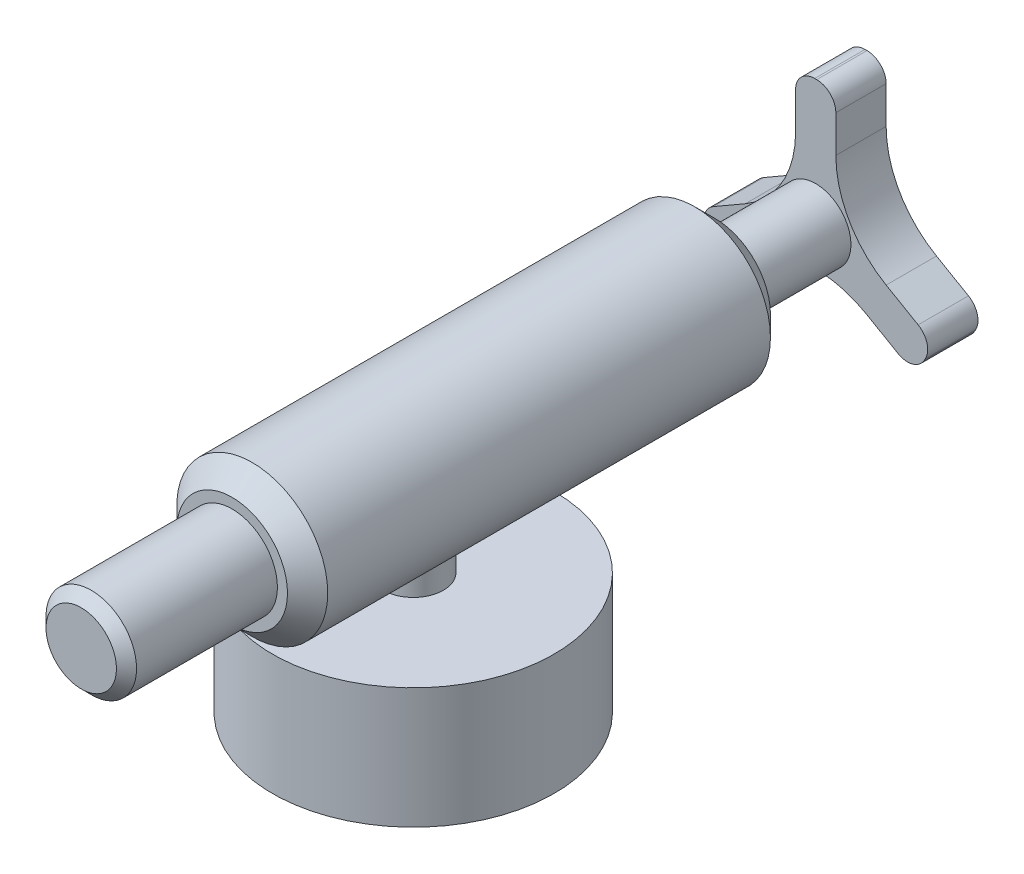
ISO-10303-21;
HEADER;
FILE_DESCRIPTION(('STEP AP214'),'2;1');
FILE_NAME('part.step','',(''),(''),'','','');
FILE_SCHEMA(('AUTOMOTIVE_DESIGN { 1 0 10303 214 1 1 1 1 }'));
ENDSEC;
DATA;
#1=APPLICATION_CONTEXT('core data for automotive mechanical design processes');
#2=APPLICATION_PROTOCOL_DEFINITION('international standard','automotive_design',2000,#1);
#3=PRODUCT_CONTEXT('',#1,'mechanical');
#4=PRODUCT('Part','Part','',(#3));
#5=PRODUCT_RELATED_PRODUCT_CATEGORY('part','',(#4));
#6=PRODUCT_DEFINITION_FORMATION('','',#4);
#7=PRODUCT_DEFINITION_CONTEXT('part definition',#1,'design');
#8=PRODUCT_DEFINITION('design','',#6,#7);
#9=PRODUCT_DEFINITION_SHAPE('','',#8);
#10=(LENGTH_UNIT() NAMED_UNIT(*) SI_UNIT(.MILLI.,.METRE.));
#11=(NAMED_UNIT(*) PLANE_ANGLE_UNIT() SI_UNIT($,.RADIAN.));
#12=(NAMED_UNIT(*) SI_UNIT($,.STERADIAN.) SOLID_ANGLE_UNIT());
#13=UNCERTAINTY_MEASURE_WITH_UNIT(LENGTH_MEASURE(1.E-05),#10,'distance_accuracy_value','');
#14=(GEOMETRIC_REPRESENTATION_CONTEXT(3) GLOBAL_UNCERTAINTY_ASSIGNED_CONTEXT((#13)) GLOBAL_UNIT_ASSIGNED_CONTEXT((#10,
#11,#12)) REPRESENTATION_CONTEXT('',''));
#15=CARTESIAN_POINT('',(0.,0.,0.));
#16=DIRECTION('',(0.,0.,1.));
#17=DIRECTION('',(1.,0.,0.));
#18=AXIS2_PLACEMENT_3D('',#15,#16,#17);
#19=CARTESIAN_POINT('',(0.,0.,0.));
#20=DIRECTION('',(0.,-1.,0.));
#21=DIRECTION('',(0.,0.,-1.));
#22=AXIS2_PLACEMENT_3D('',#19,#20,#21);
#23=CYLINDRICAL_SURFACE('',#22,3.);
#24=CARTESIAN_POINT('',(0.,12.,0.));
#25=DIRECTION('',(0.,-1.,0.));
#26=DIRECTION('',(0.,0.,-1.));
#27=AXIS2_PLACEMENT_3D('',#24,#25,#26);
#28=CIRCLE('',#27,3.);
#29=CARTESIAN_POINT('',(0.,12.,-3.));
#30=VERTEX_POINT('',#29);
#31=EDGE_CURVE('E276',#30,#30,#28,.T.);
#32=ORIENTED_EDGE('',*,*,#31,.F.);
#33=EDGE_LOOP('',(#32));
#34=FACE_BOUND('',#33,.T.);
#35=CARTESIAN_POINT('',(0.,14.5,-3.));
#36=CARTESIAN_POINT('',(-0.0806632009395358,14.5000011102953,-2.9999983890229));
#37=CARTESIAN_POINT('',(-0.161354413498373,14.5013063104993,-2.99674011548));
#38=CARTESIAN_POINT('',(-0.322146094522253,14.5064881382347,-2.9837470954671));
#39=CARTESIAN_POINT('',(-0.402246157981983,14.5103663882538,-2.97400826254011));
#40=CARTESIAN_POINT('',(-0.641096781067452,14.5257536519124,-2.9351288598822));
#41=CARTESIAN_POINT('',(-0.798158082521719,14.5410147773376,-2.89632569245522));
#42=CARTESIAN_POINT('',(-1.10247033899881,14.5798854087302,-2.79468577218911));
#43=CARTESIAN_POINT('',(-1.24975157753076,14.6034675647033,-2.73192770096983));
#44=CARTESIAN_POINT('',(-1.53159737405797,14.6566512277593,-2.58447126970495));
#45=CARTESIAN_POINT('',(-1.66616632427491,14.6862506445953,-2.49978052573424));
#46=CARTESIAN_POINT('',(-1.92525452632722,14.7500365964064,-2.30664674369764));
#47=CARTESIAN_POINT('',(-2.04909421803168,14.7843655162606,-2.19734001336868));
#48=CARTESIAN_POINT('',(-2.27726169757605,14.8530913762232,-1.95989999705686));
#49=CARTESIAN_POINT('',(-2.38157993941976,14.8874883413408,-1.8317575548035));
#50=CARTESIAN_POINT('',(-2.5723120820679,14.9541581145327,-1.55335789398784));
#51=CARTESIAN_POINT('',(-2.65772253361338,14.9862682582561,-1.40237027079118));
#52=CARTESIAN_POINT('',(-2.80163201676496,15.0424952944666,-1.08669540254387));
#53=CARTESIAN_POINT('',(-2.86014383023324,15.066615981907,-0.922014708274903));
#54=CARTESIAN_POINT('',(-2.94584825055478,15.1026046345439,-0.591431499566553));
#55=CARTESIAN_POINT('',(-2.974340952837,15.1149786946074,-0.425923146617134));
#56=CARTESIAN_POINT('',(-3.00325943833354,15.1275399393214,-0.0920475025576346));
#57=CARTESIAN_POINT('',(-3.00369902341366,15.1277331168493,0.076318341908644));
#58=CARTESIAN_POINT('',(-2.97748405223855,15.1163424960873,0.398635007225334));
#59=CARTESIAN_POINT('',(-2.95271297167583,15.1055773755829,0.552773571723856));
#60=CARTESIAN_POINT('',(-2.87992032013237,15.074857187058,0.854489334113111));
#61=CARTESIAN_POINT('',(-2.83189469212407,15.0549005154937,1.00206538218922));
#62=CARTESIAN_POINT('',(-2.71304209891512,15.0076077233483,1.29002675426027));
#63=CARTESIAN_POINT('',(-2.64176979349676,14.9801293107012,1.43020385857296));
#64=CARTESIAN_POINT('',(-2.47875969107453,14.9209282542387,1.69712372455143));
#65=CARTESIAN_POINT('',(-2.38701420764467,14.8892040181714,1.82386141410673));
#66=CARTESIAN_POINT('',(-2.17732589918875,14.82209894884,2.07061459320028));
#67=CARTESIAN_POINT('',(-2.05790619445786,14.7866250253508,2.1893530941683));
#68=CARTESIAN_POINT('',(-1.80047164114338,14.7181026256327,2.40552671700379));
#69=CARTESIAN_POINT('',(-1.66245309800114,14.685054633322,2.50295759611564));
#70=CARTESIAN_POINT('',(-1.36811647890929,14.6242797810299,2.67542617112355));
#71=CARTESIAN_POINT('',(-1.21149073701985,14.5966709485683,2.74998342179553));
#72=CARTESIAN_POINT('',(-0.886535648224184,14.5507775750691,2.87125179161714));
#73=CARTESIAN_POINT('',(-0.718212295274479,14.5324882980644,2.91797705633613));
#74=CARTESIAN_POINT('',(-0.385343831411759,14.5081579073962,2.97967244312955));
#75=CARTESIAN_POINT('',(-0.221164940978293,14.5014558124973,2.99635868138034));
#76=CARTESIAN_POINT('',(0.107767964711718,14.4989728223406,3.00256965079292));
#77=CARTESIAN_POINT('',(0.272521819835824,14.5031890962656,2.99210142232125));
#78=CARTESIAN_POINT('',(0.590149108683041,14.5216364940437,2.94556237117203));
#79=CARTESIAN_POINT('',(0.743223737663438,14.5354091298172,2.91066302947361));
#80=CARTESIAN_POINT('',(1.04120314209095,14.5711083789175,2.81784643753521));
#81=CARTESIAN_POINT('',(1.18610686533643,14.593036039652,2.7599262304967));
#82=CARTESIAN_POINT('',(1.46861817872592,14.6437510784379,2.62082259048036));
#83=CARTESIAN_POINT('',(1.60586703413639,14.6727277603032,2.53898179193636));
#84=CARTESIAN_POINT('',(1.86516538686655,14.7343995288168,2.35508951414045));
#85=CARTESIAN_POINT('',(1.98720876112942,14.7670961033449,2.25302993561202));
#86=CARTESIAN_POINT('',(2.2210845645563,14.8353232354295,2.02369498057988));
#87=CARTESIAN_POINT('',(2.3317109007594,14.8708983786286,1.89519968775731));
#88=CARTESIAN_POINT('',(2.53012679607026,14.9388749062386,1.62083987546932));
#89=CARTESIAN_POINT('',(2.6179125918181,14.9712757670859,1.47497249942789));
#90=CARTESIAN_POINT('',(2.76871125308743,15.029285501401,1.16780745817163));
#91=CARTESIAN_POINT('',(2.83147589251401,15.0548255367903,1.00637400141696));
#92=CARTESIAN_POINT('',(2.92844432884615,15.0951448977689,0.673899522192013));
#93=CARTESIAN_POINT('',(2.96266920524751,15.1099321643282,0.502865690403395));
#94=CARTESIAN_POINT('',(2.9995734283829,15.1259236107162,0.16930814815297));
#95=CARTESIAN_POINT('',(3.00434563234764,15.1280286856534,0.00705774354923237));
#96=CARTESIAN_POINT('',(2.98770473002408,15.1207774587277,-0.315817289508828));
#97=CARTESIAN_POINT('',(2.96629494876877,15.1114226122398,-0.476442121794099));
#98=CARTESIAN_POINT('',(2.89960708102334,15.0831002665888,-0.784998274274976));
#99=CARTESIAN_POINT('',(2.85530635681061,15.0645275327494,-0.933180373161246));
#100=CARTESIAN_POINT('',(2.7450080562502,15.0201399713456,-1.22006798291911));
#101=CARTESIAN_POINT('',(2.67900448789151,14.9943231440242,-1.35877086385317));
#102=CARTESIAN_POINT('',(2.52280960319953,14.9365208959876,-1.63141427718623));
#103=CARTESIAN_POINT('',(2.43144976133989,14.9042669187468,-1.76462742397582));
#104=CARTESIAN_POINT('',(2.2288364197758,14.8380427809247,-2.01449055720097));
#105=CARTESIAN_POINT('',(2.11757692397659,14.8040721052933,-2.13113553231325));
#106=CARTESIAN_POINT('',(1.86976526416226,14.7355971048839,-2.35230196481483));
#107=CARTESIAN_POINT('',(1.73204093441049,14.7012009805601,-2.45554705905594));
#108=CARTESIAN_POINT('',(1.43982353523661,14.6379915482106,-2.63751446935514));
#109=CARTESIAN_POINT('',(1.28532271229705,14.6091808388515,-2.71622538095622));
#110=CARTESIAN_POINT('',(1.04589046292377,14.5728517211392,-2.81307350088879));
#111=CARTESIAN_POINT('',(0.965550642326296,14.561957476294,-2.84165597012401));
#112=CARTESIAN_POINT('',(0.802472015195127,14.5426037620575,-2.89193765829433));
#113=CARTESIAN_POINT('',(0.719734347003783,14.5341431575171,-2.91364008684478));
#114=CARTESIAN_POINT('',(0.552707555877389,14.5199245649965,-2.94988203096378));
#115=CARTESIAN_POINT('',(0.468422937872989,14.5141597259167,-2.9644397091379));
#116=CARTESIAN_POINT('',(0.29881460894124,14.5054749059368,-2.98630365279151));
#117=CARTESIAN_POINT('',(0.213491680311737,14.502552903066,-2.99361507225066));
#118=CARTESIAN_POINT('',(0.0853730051866,14.5003640977914,-2.99908952040527));
#119=CARTESIAN_POINT('',(0.0426904255930864,14.4999994123841,-3.00000085259818));
#120=CARTESIAN_POINT('',(0.,14.5,-3.));
#121=B_SPLINE_CURVE_WITH_KNOTS('',3,(#35,#36,#37,#38,#39,#40,#41,#42,#43,#44,#45,#46,#47,#48,
#49,#50,#51,#52,#53,#54,#55,#56,#57,#58,#59,#60,#61,#62,#63,#64,#65,#66,#67,#68,#69,#70,#71,#72,
#73,#74,#75,#76,#77,#78,#79,#80,#81,#82,#83,#84,#85,#86,#87,#88,#89,#90,#91,#92,#93,#94,#95,#96,
#97,#98,#99,#100,#101,#102,#103,#104,#105,#106,#107,#108,#109,#110,#111,#112,#113,#114,#115,
#116,#117,#118,#119,#120),.UNSPECIFIED.,.T.,.F.,(4,2,2,2,2,2,2,2,2,2,2,2,2,2,2,2,2,2,2,2,2,2,2,
2,2,2,2,2,2,2,2,2,2,2,2,2,2,2,2,2,2,2,4),(0.,0.241952995066616,0.484058703589861,
0.968979675762157,1.45232140795763,1.93549552527002,2.43941494725621,2.94358014576643,
3.47018310403851,3.99653556852428,4.49901580138268,5.00124881685758,5.46852914780512,
5.93589103065597,6.4127911162975,6.88987055088801,7.40382945961362,7.91789061441126,
8.44210791925736,8.96605856352212,9.45899198973538,9.9517976253665,10.4224610552807,
10.8931849567222,11.3783069227892,11.8636236142998,12.3809813411815,12.8984242574715,
13.4208798989277,13.9429493115043,14.4274493227065,14.9118878102609,15.3771690000468,
15.8425787588927,16.3346362426656,16.8268422420412,17.3509605748228,17.8753221764233,
18.1329380344125,18.3904335342851,18.6472710222664,18.9039257004315,19.0319776028183),.UNSPECIFIED.);
#122=CARTESIAN_POINT('',(0.,14.5,-3.));
#123=VERTEX_POINT('',#122);
#124=EDGE_CURVE('E308',#123,#123,#121,.T.);
#125=ORIENTED_EDGE('',*,*,#124,.F.);
#126=EDGE_LOOP('',(#125));
#127=FACE_BOUND('',#126,.T.);
#128=ADVANCED_FACE('F39',(#34,#127),#23,.T.);
#129=CARTESIAN_POINT('',(-10.,0.,0.));
#130=DIRECTION('',(0.,1.,0.));
#131=DIRECTION('',(0.,0.,1.));
#132=AXIS2_PLACEMENT_3D('',#129,#130,#131);
#133=PLANE('',#132);
#134=CARTESIAN_POINT('',(0.,0.,0.));
#135=DIRECTION('',(0.,-1.,0.));
#136=DIRECTION('',(0.,0.,-1.));
#137=AXIS2_PLACEMENT_3D('',#134,#135,#136);
#138=CIRCLE('',#137,10.);
#139=CARTESIAN_POINT('',(0.,0.,-10.));
#140=VERTEX_POINT('',#139);
#141=EDGE_CURVE('E304',#140,#140,#138,.T.);
#142=ORIENTED_EDGE('',*,*,#141,.T.);
#143=EDGE_LOOP('',(#142));
#144=FACE_BOUND('',#143,.T.);
#145=ADVANCED_FACE('F419',(#144),#133,.F.);
#146=CARTESIAN_POINT('',(0.,0.,0.));
#147=DIRECTION('',(0.,-1.,0.));
#148=DIRECTION('',(0.,0.,-1.));
#149=AXIS2_PLACEMENT_3D('',#146,#147,#148);
#150=CYLINDRICAL_SURFACE('',#149,10.);
#151=ORIENTED_EDGE('',*,*,#141,.F.);
#152=EDGE_LOOP('',(#151));
#153=FACE_BOUND('',#152,.T.);
#154=CARTESIAN_POINT('',(0.,10.,0.));
#155=DIRECTION('',(0.,-1.,0.));
#156=DIRECTION('',(0.,0.,-1.));
#157=AXIS2_PLACEMENT_3D('',#154,#155,#156);
#158=CIRCLE('',#157,10.);
#159=CARTESIAN_POINT('',(0.,10.,-10.));
#160=VERTEX_POINT('',#159);
#161=EDGE_CURVE('E299',#160,#160,#158,.T.);
#162=ORIENTED_EDGE('',*,*,#161,.T.);
#163=EDGE_LOOP('',(#162));
#164=FACE_BOUND('',#163,.T.);
#165=ADVANCED_FACE('F426',(#153,#164),#150,.T.);
#166=CARTESIAN_POINT('',(-12.,10.,0.));
#167=DIRECTION('',(0.,1.,0.));
#168=DIRECTION('',(0.,0.,1.));
#169=AXIS2_PLACEMENT_3D('',#166,#167,#168);
#170=PLANE('',#169);
#171=ORIENTED_EDGE('',*,*,#161,.F.);
#172=EDGE_LOOP('',(#171));
#173=FACE_BOUND('',#172,.T.);
#174=CARTESIAN_POINT('',(0.,10.,0.));
#175=DIRECTION('',(0.,-1.,0.));
#176=DIRECTION('',(0.,0.,-1.));
#177=AXIS2_PLACEMENT_3D('',#174,#175,#176);
#178=CIRCLE('',#177,12.);
#179=CARTESIAN_POINT('',(0.,10.,-12.));
#180=VERTEX_POINT('',#179);
#181=EDGE_CURVE('E300',#180,#180,#178,.T.);
#182=ORIENTED_EDGE('',*,*,#181,.T.);
#183=EDGE_LOOP('',(#182));
#184=FACE_BOUND('',#183,.T.);
#185=ADVANCED_FACE('F449',(#173,#184),#170,.F.);
#186=CARTESIAN_POINT('',(0.,0.,0.));
#187=DIRECTION('',(0.,-1.,0.));
#188=DIRECTION('',(0.,0.,-1.));
#189=AXIS2_PLACEMENT_3D('',#186,#187,#188);
#190=CYLINDRICAL_SURFACE('',#189,12.);
#191=ORIENTED_EDGE('',*,*,#181,.F.);
#192=EDGE_LOOP('',(#191));
#193=FACE_BOUND('',#192,.T.);
#194=CARTESIAN_POINT('',(0.,0.,0.));
#195=DIRECTION('',(0.,-1.,0.));
#196=DIRECTION('',(0.,0.,-1.));
#197=AXIS2_PLACEMENT_3D('',#194,#195,#196);
#198=CIRCLE('',#197,12.);
#199=CARTESIAN_POINT('',(0.,0.,-12.));
#200=VERTEX_POINT('',#199);
#201=EDGE_CURVE('E294',#200,#200,#198,.T.);
#202=ORIENTED_EDGE('',*,*,#201,.T.);
#203=EDGE_LOOP('',(#202));
#204=FACE_BOUND('',#203,.T.);
#205=ADVANCED_FACE('F446',(#193,#204),#190,.F.);
#206=CARTESIAN_POINT('',(-12.,0.,0.));
#207=DIRECTION('',(0.,1.,0.));
#208=DIRECTION('',(0.,0.,1.));
#209=AXIS2_PLACEMENT_3D('',#206,#207,#208);
#210=PLANE('',#209);
#211=ORIENTED_EDGE('',*,*,#201,.F.);
#212=EDGE_LOOP('',(#211));
#213=FACE_BOUND('',#212,.T.);
#214=CARTESIAN_POINT('',(0.,0.,0.));
#215=DIRECTION('',(0.,-1.,0.));
#216=DIRECTION('',(0.,0.,-1.));
#217=AXIS2_PLACEMENT_3D('',#214,#215,#216);
#218=CIRCLE('',#217,14.);
#219=CARTESIAN_POINT('',(0.,0.,-14.));
#220=VERTEX_POINT('',#219);
#221=EDGE_CURVE('E292',#220,#220,#218,.T.);
#222=ORIENTED_EDGE('',*,*,#221,.T.);
#223=EDGE_LOOP('',(#222));
#224=FACE_BOUND('',#223,.T.);
#225=ADVANCED_FACE('F438',(#213,#224),#210,.F.);
#226=CARTESIAN_POINT('',(0.,0.,0.));
#227=DIRECTION('',(0.,-1.,0.));
#228=DIRECTION('',(0.,0.,-1.));
#229=AXIS2_PLACEMENT_3D('',#226,#227,#228);
#230=CYLINDRICAL_SURFACE('',#229,14.);
#231=ORIENTED_EDGE('',*,*,#221,.F.);
#232=EDGE_LOOP('',(#231));
#233=FACE_BOUND('',#232,.T.);
#234=CARTESIAN_POINT('',(0.,12.,0.));
#235=DIRECTION('',(0.,-1.,0.));
#236=DIRECTION('',(0.,0.,-1.));
#237=AXIS2_PLACEMENT_3D('',#234,#235,#236);
#238=CIRCLE('',#237,14.);
#239=CARTESIAN_POINT('',(0.,12.,-14.));
#240=VERTEX_POINT('',#239);
#241=EDGE_CURVE('E289',#240,#240,#238,.T.);
#242=ORIENTED_EDGE('',*,*,#241,.T.);
#243=EDGE_LOOP('',(#242));
#244=FACE_BOUND('',#243,.T.);
#245=ADVANCED_FACE('F432',(#233,#244),#230,.T.);
#246=CARTESIAN_POINT('',(-14.,12.,0.));
#247=DIRECTION('',(0.,-1.,0.));
#248=DIRECTION('',(0.,0.,-1.));
#249=AXIS2_PLACEMENT_3D('',#246,#247,#248);
#250=PLANE('',#249);
#251=ORIENTED_EDGE('',*,*,#241,.F.);
#252=EDGE_LOOP('',(#251));
#253=FACE_BOUND('',#252,.T.);
#254=ORIENTED_EDGE('',*,*,#31,.T.);
#255=EDGE_LOOP('',(#254));
#256=FACE_BOUND('',#255,.T.);
#257=ADVANCED_FACE('F323',(#253,#256),#250,.F.);
#258=CARTESIAN_POINT('',(0.,22.,18.));
#259=DIRECTION('',(0.,0.,-1.));
#260=DIRECTION('',(-1.,0.,0.));
#261=AXIS2_PLACEMENT_3D('',#258,#259,#260);
#262=CYLINDRICAL_SURFACE('',#261,7.5);
#263=CARTESIAN_POINT('',(0.,22.,16.));
#264=DIRECTION('',(0.,0.,1.));
#265=DIRECTION('',(1.,0.,0.));
#266=AXIS2_PLACEMENT_3D('',#263,#264,#265);
#267=CIRCLE('',#266,7.5);
#268=CARTESIAN_POINT('',(7.5,22.,16.));
#269=VERTEX_POINT('',#268);
#270=EDGE_CURVE('E473',#269,#269,#267,.F.);
#271=ORIENTED_EDGE('',*,*,#270,.T.);
#272=EDGE_LOOP('',(#271));
#273=FACE_BOUND('',#272,.T.);
#274=CARTESIAN_POINT('',(0.,22.,-28.));
#275=DIRECTION('',(0.,0.,1.));
#276=DIRECTION('',(1.,0.,0.));
#277=AXIS2_PLACEMENT_3D('',#274,#275,#276);
#278=CIRCLE('',#277,7.5);
#279=CARTESIAN_POINT('',(7.5,22.,-28.));
#280=VERTEX_POINT('',#279);
#281=EDGE_CURVE('E468',#280,#280,#278,.T.);
#282=ORIENTED_EDGE('',*,*,#281,.T.);
#283=EDGE_LOOP('',(#282));
#284=FACE_BOUND('',#283,.T.);
#285=ORIENTED_EDGE('',*,*,#124,.T.);
#286=EDGE_LOOP('',(#285));
#287=FACE_BOUND('',#286,.T.);
#288=ADVANCED_FACE('F318',(#273,#284,#287),#262,.T.);
#289=CARTESIAN_POINT('',(0.,22.,18.));
#290=DIRECTION('',(0.,0.,1.));
#291=DIRECTION('',(1.,0.,0.));
#292=AXIS2_PLACEMENT_3D('',#289,#290,#291);
#293=PLANE('',#292);
#294=CARTESIAN_POINT('',(0.,22.,18.));
#295=DIRECTION('',(0.,0.,1.));
#296=DIRECTION('',(1.,0.,0.));
#297=AXIS2_PLACEMENT_3D('',#294,#295,#296);
#298=CIRCLE('',#297,4.5);
#299=CARTESIAN_POINT('',(4.5,22.,18.));
#300=VERTEX_POINT('',#299);
#301=EDGE_CURVE('E281',#300,#300,#298,.T.);
#302=ORIENTED_EDGE('',*,*,#301,.F.);
#303=EDGE_LOOP('',(#302));
#304=FACE_BOUND('',#303,.T.);
#305=CARTESIAN_POINT('',(0.,22.,18.));
#306=DIRECTION('',(0.,0.,1.));
#307=DIRECTION('',(1.,0.,0.));
#308=AXIS2_PLACEMENT_3D('',#305,#306,#307);
#309=CIRCLE('',#308,5.5);
#310=CARTESIAN_POINT('',(5.5,22.,18.));
#311=VERTEX_POINT('',#310);
#312=EDGE_CURVE('E314',#311,#311,#309,.T.);
#313=ORIENTED_EDGE('',*,*,#312,.T.);
#314=EDGE_LOOP('',(#313));
#315=FACE_BOUND('',#314,.T.);
#316=ADVANCED_FACE('F325',(#304,#315),#293,.T.);
#317=CARTESIAN_POINT('',(0.,22.,-30.));
#318=DIRECTION('',(0.,0.,1.));
#319=DIRECTION('',(1.,0.,0.));
#320=AXIS2_PLACEMENT_3D('',#317,#318,#319);
#321=PLANE('',#320);
#322=CARTESIAN_POINT('',(0.,22.,-30.));
#323=DIRECTION('',(0.,0.,-1.));
#324=DIRECTION('',(-1.,0.,0.));
#325=AXIS2_PLACEMENT_3D('',#322,#323,#324);
#326=CIRCLE('',#325,3.5);
#327=CARTESIAN_POINT('',(-3.5,22.,-30.));
#328=VERTEX_POINT('',#327);
#329=EDGE_CURVE('E11',#328,#328,#326,.T.);
#330=ORIENTED_EDGE('',*,*,#329,.F.);
#331=EDGE_LOOP('',(#330));
#332=FACE_BOUND('',#331,.T.);
#333=CARTESIAN_POINT('',(0.,22.,-30.));
#334=DIRECTION('',(0.,0.,1.));
#335=DIRECTION('',(1.,0.,0.));
#336=AXIS2_PLACEMENT_3D('',#333,#334,#335);
#337=CIRCLE('',#336,5.5);
#338=CARTESIAN_POINT('',(5.5,22.,-30.));
#339=VERTEX_POINT('',#338);
#340=EDGE_CURVE('E284',#339,#339,#337,.F.);
#341=ORIENTED_EDGE('',*,*,#340,.T.);
#342=EDGE_LOOP('',(#341));
#343=FACE_BOUND('',#342,.T.);
#344=ADVANCED_FACE('F330',(#332,#343),#321,.F.);
#345=CARTESIAN_POINT('',(0.,22.,18.));
#346=DIRECTION('',(0.,0.,-1.));
#347=DIRECTION('',(-1.,0.,0.));
#348=AXIS2_PLACEMENT_3D('',#345,#346,#347);
#349=CONICAL_SURFACE('',#348,5.5,0.785398163397447);
#350=ORIENTED_EDGE('',*,*,#270,.F.);
#351=EDGE_LOOP('',(#350));
#352=FACE_BOUND('',#351,.T.);
#353=ORIENTED_EDGE('',*,*,#312,.F.);
#354=EDGE_LOOP('',(#353));
#355=FACE_BOUND('',#354,.T.);
#356=ADVANCED_FACE('F332',(#352,#355),#349,.T.);
#357=CARTESIAN_POINT('',(0.,22.,-28.));
#358=DIRECTION('',(0.,0.,1.));
#359=DIRECTION('',(1.,0.,0.));
#360=AXIS2_PLACEMENT_3D('',#357,#358,#359);
#361=CONICAL_SURFACE('',#360,7.5,0.78539816339745);
#362=ORIENTED_EDGE('',*,*,#340,.F.);
#363=EDGE_LOOP('',(#362));
#364=FACE_BOUND('',#363,.T.);
#365=ORIENTED_EDGE('',*,*,#281,.F.);
#366=EDGE_LOOP('',(#365));
#367=FACE_BOUND('',#366,.T.);
#368=ADVANCED_FACE('F340',(#364,#367),#361,.T.);
#369=CARTESIAN_POINT('',(0.,22.,33.));
#370=DIRECTION('',(0.,0.,-1.));
#371=DIRECTION('',(-1.,0.,0.));
#372=AXIS2_PLACEMENT_3D('',#369,#370,#371);
#373=CYLINDRICAL_SURFACE('',#372,4.5);
#374=CARTESIAN_POINT('',(0.,22.,32.));
#375=DIRECTION('',(0.,0.,1.));
#376=DIRECTION('',(1.,0.,0.));
#377=AXIS2_PLACEMENT_3D('',#374,#375,#376);
#378=CIRCLE('',#377,4.5);
#379=CARTESIAN_POINT('',(4.5,22.,32.));
#380=VERTEX_POINT('',#379);
#381=EDGE_CURVE('E43',#380,#380,#378,.F.);
#382=ORIENTED_EDGE('',*,*,#381,.T.);
#383=EDGE_LOOP('',(#382));
#384=FACE_BOUND('',#383,.T.);
#385=ORIENTED_EDGE('',*,*,#301,.T.);
#386=EDGE_LOOP('',(#385));
#387=FACE_BOUND('',#386,.T.);
#388=ADVANCED_FACE('F334',(#384,#387),#373,.T.);
#389=CARTESIAN_POINT('',(0.,22.,33.));
#390=DIRECTION('',(0.,0.,1.));
#391=DIRECTION('',(1.,0.,0.));
#392=AXIS2_PLACEMENT_3D('',#389,#390,#391);
#393=PLANE('',#392);
#394=CARTESIAN_POINT('',(0.,22.,33.));
#395=DIRECTION('',(0.,0.,1.));
#396=DIRECTION('',(1.,0.,0.));
#397=AXIS2_PLACEMENT_3D('',#394,#395,#396);
#398=CIRCLE('',#397,3.50000000000002);
#399=CARTESIAN_POINT('',(3.50000000000002,22.,33.));
#400=VERTEX_POINT('',#399);
#401=EDGE_CURVE('E283',#400,#400,#398,.T.);
#402=ORIENTED_EDGE('',*,*,#401,.T.);
#403=EDGE_LOOP('',(#402));
#404=FACE_BOUND('',#403,.T.);
#405=ADVANCED_FACE('F336',(#404),#393,.T.);
#406=CARTESIAN_POINT('',(0.,22.,33.));
#407=DIRECTION('',(0.,0.,-1.));
#408=DIRECTION('',(-1.,0.,0.));
#409=AXIS2_PLACEMENT_3D('',#406,#407,#408);
#410=CONICAL_SURFACE('',#409,3.50000000000002,0.785398163397446);
#411=ORIENTED_EDGE('',*,*,#381,.F.);
#412=EDGE_LOOP('',(#411));
#413=FACE_BOUND('',#412,.T.);
#414=ORIENTED_EDGE('',*,*,#401,.F.);
#415=EDGE_LOOP('',(#414));
#416=FACE_BOUND('',#415,.T.);
#417=ADVANCED_FACE('F41',(#413,#416),#410,.T.);
#418=CARTESIAN_POINT('',(0.,22.,-40.));
#419=DIRECTION('',(0.,0.,1.));
#420=DIRECTION('',(1.,0.,0.));
#421=AXIS2_PLACEMENT_3D('',#418,#419,#420);
#422=CYLINDRICAL_SURFACE('',#421,3.5);
#423=CARTESIAN_POINT('',(0.,22.,-40.));
#424=DIRECTION('',(0.,0.,-1.));
#425=DIRECTION('',(-1.,0.,0.));
#426=AXIS2_PLACEMENT_3D('',#423,#424,#425);
#427=CIRCLE('',#426,3.5);
#428=CARTESIAN_POINT('',(-3.5,22.,-40.));
#429=VERTEX_POINT('',#428);
#430=EDGE_CURVE('E280',#429,#429,#427,.T.);
#431=ORIENTED_EDGE('',*,*,#430,.F.);
#432=EDGE_LOOP('',(#431));
#433=FACE_BOUND('',#432,.T.);
#434=ORIENTED_EDGE('',*,*,#329,.T.);
#435=EDGE_LOOP('',(#434));
#436=FACE_BOUND('',#435,.T.);
#437=ADVANCED_FACE('F342',(#433,#436),#422,.T.);
#438=CARTESIAN_POINT('',(12.,28.9282032302754,-45.));
#439=DIRECTION('',(0.,0.,1.));
#440=DIRECTION('',(1.,0.,0.));
#441=AXIS2_PLACEMENT_3D('',#438,#439,#440);
#442=CYLINDRICAL_SURFACE('',#441,10.);
#443=CARTESIAN_POINT('',(12.,28.9282032302754,-40.));
#444=DIRECTION('',(0.,0.,1.));
#445=DIRECTION('',(1.,0.,0.));
#446=AXIS2_PLACEMENT_3D('',#443,#444,#445);
#447=CIRCLE('',#446,10.);
#448=CARTESIAN_POINT('',(2.,28.9282032302754,-40.));
#449=VERTEX_POINT('',#448);
#450=CARTESIAN_POINT('',(7.00000000000012,20.2679491924309,-40.));
#451=VERTEX_POINT('',#450);
#452=EDGE_CURVE('E196',#449,#451,#447,.T.);
#453=ORIENTED_EDGE('',*,*,#452,.T.);
#454=DIRECTION('',(0.,0.,1.));
#455=VECTOR('',#454,1.);
#456=CARTESIAN_POINT('',(7.00000000000012,20.2679491924309,-45.));
#457=LINE('',#456,#455);
#458=CARTESIAN_POINT('',(7.00000000000012,20.2679491924309,-45.));
#459=VERTEX_POINT('',#458);
#460=EDGE_CURVE('E274',#459,#451,#457,.T.);
#461=ORIENTED_EDGE('',*,*,#460,.F.);
#462=CARTESIAN_POINT('',(12.,28.9282032302754,-45.));
#463=DIRECTION('',(0.,0.,1.));
#464=DIRECTION('',(1.,0.,0.));
#465=AXIS2_PLACEMENT_3D('',#462,#463,#464);
#466=CIRCLE('',#465,10.);
#467=CARTESIAN_POINT('',(2.,28.9282032302754,-45.));
#468=VERTEX_POINT('',#467);
#469=EDGE_CURVE('E232',#468,#459,#466,.T.);
#470=ORIENTED_EDGE('',*,*,#469,.F.);
#471=DIRECTION('',(0.,0.,1.));
#472=VECTOR('',#471,1.);
#473=CARTESIAN_POINT('',(2.,28.9282032302754,-45.));
#474=LINE('',#473,#472);
#475=EDGE_CURVE('E193',#468,#449,#474,.T.);
#476=ORIENTED_EDGE('',*,*,#475,.T.);
#477=EDGE_LOOP('',(#453,#461,#470,#476));
#478=FACE_BOUND('',#477,.T.);
#479=ADVANCED_FACE('F345',(#478),#442,.F.);
#480=CARTESIAN_POINT('',(10.179869280115,18.4320508075688,-45.));
#481=DIRECTION('',(-0.499999999999992,-0.866025403784443,0.));
#482=DIRECTION('',(0.866025403784443,-0.499999999999992,0.));
#483=AXIS2_PLACEMENT_3D('',#480,#481,#482);
#484=PLANE('',#483);
#485=DIRECTION('',(0.866025403784443,-0.499999999999992,0.));
#486=VECTOR('',#485,1.);
#487=CARTESIAN_POINT('',(10.179869280115,18.4320508075688,-40.));
#488=LINE('',#487,#486);
#489=CARTESIAN_POINT('',(10.179869280115,18.4320508075688,-40.));
#490=VERTEX_POINT('',#489);
#491=EDGE_CURVE('E203',#451,#490,#488,.T.);
#492=ORIENTED_EDGE('',*,*,#491,.T.);
#493=DIRECTION('',(0.,0.,1.));
#494=VECTOR('',#493,1.);
#495=CARTESIAN_POINT('',(10.179869280115,18.4320508075688,-45.));
#496=LINE('',#495,#494);
#497=CARTESIAN_POINT('',(10.179869280115,18.4320508075688,-45.));
#498=VERTEX_POINT('',#497);
#499=EDGE_CURVE('E275',#498,#490,#496,.T.);
#500=ORIENTED_EDGE('',*,*,#499,.F.);
#501=DIRECTION('',(0.866025403784443,-0.499999999999992,0.));
#502=VECTOR('',#501,1.);
#503=CARTESIAN_POINT('',(10.179869280115,18.4320508075688,-45.));
#504=LINE('',#503,#502);
#505=EDGE_CURVE('E131',#459,#498,#504,.T.);
#506=ORIENTED_EDGE('',*,*,#505,.F.);
#507=ORIENTED_EDGE('',*,*,#460,.T.);
#508=EDGE_LOOP('',(#492,#500,#506,#507));
#509=FACE_BOUND('',#508,.T.);
#510=ADVANCED_FACE('F349',(#509),#484,.F.);
#511=CARTESIAN_POINT('',(9.22986928011503,16.7866025403784,-45.));
#512=DIRECTION('',(0.,0.,1.));
#513=DIRECTION('',(1.,0.,0.));
#514=AXIS2_PLACEMENT_3D('',#511,#512,#513);
#515=CYLINDRICAL_SURFACE('',#514,1.9);
#516=CARTESIAN_POINT('',(9.22986928011503,16.7866025403784,-40.));
#517=DIRECTION('',(0.,0.,-1.));
#518=DIRECTION('',(1.,0.,0.));
#519=AXIS2_PLACEMENT_3D('',#516,#517,#518);
#520=CIRCLE('',#519,1.9);
#521=CARTESIAN_POINT('',(10.8753175473055,15.8366025403784,-40.));
#522=VERTEX_POINT('',#521);
#523=EDGE_CURVE('E201',#490,#522,#520,.T.);
#524=ORIENTED_EDGE('',*,*,#523,.T.);
#525=DIRECTION('',(0.,0.,1.));
#526=VECTOR('',#525,1.);
#527=CARTESIAN_POINT('',(10.8753175473055,15.8366025403784,-45.));
#528=LINE('',#527,#526);
#529=CARTESIAN_POINT('',(10.8753175473055,15.8366025403784,-45.));
#530=VERTEX_POINT('',#529);
#531=EDGE_CURVE('E267',#530,#522,#528,.T.);
#532=ORIENTED_EDGE('',*,*,#531,.F.);
#533=CARTESIAN_POINT('',(9.22986928011503,16.7866025403784,-45.));
#534=DIRECTION('',(0.,0.,-1.));
#535=DIRECTION('',(1.,0.,0.));
#536=AXIS2_PLACEMENT_3D('',#533,#534,#535);
#537=CIRCLE('',#536,1.9);
#538=EDGE_CURVE('E650',#498,#530,#537,.T.);
#539=ORIENTED_EDGE('',*,*,#538,.F.);
#540=ORIENTED_EDGE('',*,*,#499,.T.);
#541=EDGE_LOOP('',(#524,#532,#539,#540));
#542=FACE_BOUND('',#541,.T.);
#543=ADVANCED_FACE('F352',(#542),#515,.T.);
#544=CARTESIAN_POINT('',(10.7753175473055,15.6633974596215,-45.));
#545=DIRECTION('',(-0.866025403784442,0.499999999999994,0.));
#546=DIRECTION('',(-0.499999999999994,-0.866025403784442,0.));
#547=AXIS2_PLACEMENT_3D('',#544,#545,#546);
#548=PLANE('',#547);
#549=DIRECTION('',(-0.499999999999994,-0.866025403784442,0.));
#550=VECTOR('',#549,1.);
#551=CARTESIAN_POINT('',(10.7753175473055,15.6633974596215,-40.));
#552=LINE('',#551,#550);
#553=CARTESIAN_POINT('',(10.7753175473055,15.6633974596215,-40.));
#554=VERTEX_POINT('',#553);
#555=EDGE_CURVE('E202',#522,#554,#552,.T.);
#556=ORIENTED_EDGE('',*,*,#555,.T.);
#557=DIRECTION('',(0.,0.,1.));
#558=VECTOR('',#557,1.);
#559=CARTESIAN_POINT('',(10.7753175473055,15.6633974596215,-45.));
#560=LINE('',#559,#558);
#561=CARTESIAN_POINT('',(10.7753175473055,15.6633974596215,-45.));
#562=VERTEX_POINT('',#561);
#563=EDGE_CURVE('E266',#562,#554,#560,.T.);
#564=ORIENTED_EDGE('',*,*,#563,.F.);
#565=DIRECTION('',(-0.499999999999994,-0.866025403784442,0.));
#566=VECTOR('',#565,1.);
#567=CARTESIAN_POINT('',(10.7753175473055,15.6633974596215,-45.));
#568=LINE('',#567,#566);
#569=EDGE_CURVE('E651',#530,#562,#568,.T.);
#570=ORIENTED_EDGE('',*,*,#569,.F.);
#571=ORIENTED_EDGE('',*,*,#531,.T.);
#572=EDGE_LOOP('',(#556,#564,#570,#571));
#573=FACE_BOUND('',#572,.T.);
#574=ADVANCED_FACE('F356',(#573),#548,.F.);
#575=CARTESIAN_POINT('',(9.12986928011503,16.6133974596215,-45.));
#576=DIRECTION('',(0.,0.,1.));
#577=DIRECTION('',(1.,0.,0.));
#578=AXIS2_PLACEMENT_3D('',#575,#576,#577);
#579=CYLINDRICAL_SURFACE('',#578,1.9);
#580=CARTESIAN_POINT('',(9.12986928011503,16.6133974596215,-40.));
#581=DIRECTION('',(0.,0.,-1.));
#582=DIRECTION('',(-1.,0.,0.));
#583=AXIS2_PLACEMENT_3D('',#580,#581,#582);
#584=CIRCLE('',#583,1.9);
#585=CARTESIAN_POINT('',(8.17986928011503,14.967949192431,-40.));
#586=VERTEX_POINT('',#585);
#587=EDGE_CURVE('E210',#554,#586,#584,.T.);
#588=ORIENTED_EDGE('',*,*,#587,.T.);
#589=DIRECTION('',(0.,0.,1.));
#590=VECTOR('',#589,1.);
#591=CARTESIAN_POINT('',(8.17986928011503,14.967949192431,-45.));
#592=LINE('',#591,#590);
#593=CARTESIAN_POINT('',(8.17986928011503,14.967949192431,-45.));
#594=VERTEX_POINT('',#593);
#595=EDGE_CURVE('E263',#594,#586,#592,.T.);
#596=ORIENTED_EDGE('',*,*,#595,.F.);
#597=CARTESIAN_POINT('',(9.12986928011503,16.6133974596215,-45.));
#598=DIRECTION('',(0.,0.,-1.));
#599=DIRECTION('',(-1.,0.,0.));
#600=AXIS2_PLACEMENT_3D('',#597,#598,#599);
#601=CIRCLE('',#600,1.9);
#602=EDGE_CURVE('E653',#562,#594,#601,.T.);
#603=ORIENTED_EDGE('',*,*,#602,.F.);
#604=ORIENTED_EDGE('',*,*,#563,.T.);
#605=EDGE_LOOP('',(#588,#596,#603,#604));
#606=FACE_BOUND('',#605,.T.);
#607=ADVANCED_FACE('F360',(#606),#579,.T.);
#608=CARTESIAN_POINT('',(4.99999999999982,16.8038475772934,-45.));
#609=DIRECTION('',(0.499999999999992,0.866025403784443,0.));
#610=DIRECTION('',(-0.866025403784443,0.499999999999992,0.));
#611=AXIS2_PLACEMENT_3D('',#608,#609,#610);
#612=PLANE('',#611);
#613=DIRECTION('',(-0.866025403784443,0.499999999999992,0.));
#614=VECTOR('',#613,1.);
#615=CARTESIAN_POINT('',(4.99999999999982,16.8038475772934,-40.));
#616=LINE('',#615,#614);
#617=CARTESIAN_POINT('',(4.99999999999982,16.8038475772934,-40.));
#618=VERTEX_POINT('',#617);
#619=EDGE_CURVE('E207',#586,#618,#616,.T.);
#620=ORIENTED_EDGE('',*,*,#619,.T.);
#621=DIRECTION('',(0.,0.,1.));
#622=VECTOR('',#621,1.);
#623=CARTESIAN_POINT('',(4.99999999999982,16.8038475772934,-45.));
#624=LINE('',#623,#622);
#625=CARTESIAN_POINT('',(4.99999999999982,16.8038475772934,-45.));
#626=VERTEX_POINT('',#625);
#627=EDGE_CURVE('E257',#626,#618,#624,.T.);
#628=ORIENTED_EDGE('',*,*,#627,.F.);
#629=DIRECTION('',(-0.866025403784443,0.499999999999992,0.));
#630=VECTOR('',#629,1.);
#631=CARTESIAN_POINT('',(4.99999999999982,16.8038475772934,-45.));
#632=LINE('',#631,#630);
#633=EDGE_CURVE('E654',#594,#626,#632,.T.);
#634=ORIENTED_EDGE('',*,*,#633,.F.);
#635=ORIENTED_EDGE('',*,*,#595,.T.);
#636=EDGE_LOOP('',(#620,#628,#634,#635));
#637=FACE_BOUND('',#636,.T.);
#638=ADVANCED_FACE('F365',(#637),#612,.F.);
#639=CARTESIAN_POINT('',(-1.44277803214427E-13,8.14359353944894,-45.));
#640=DIRECTION('',(0.,0.,1.));
#641=DIRECTION('',(1.,0.,0.));
#642=AXIS2_PLACEMENT_3D('',#639,#640,#641);
#643=CYLINDRICAL_SURFACE('',#642,10.);
#644=CARTESIAN_POINT('',(-1.44277803214427E-13,8.14359353944894,-40.));
#645=DIRECTION('',(0.,0.,1.));
#646=DIRECTION('',(-1.,0.,0.));
#647=AXIS2_PLACEMENT_3D('',#644,#645,#646);
#648=CIRCLE('',#647,10.);
#649=CARTESIAN_POINT('',(-5.00000000000022,16.8038475772933,-40.));
#650=VERTEX_POINT('',#649);
#651=EDGE_CURVE('E211',#618,#650,#648,.T.);
#652=ORIENTED_EDGE('',*,*,#651,.T.);
#653=DIRECTION('',(0.,0.,1.));
#654=VECTOR('',#653,1.);
#655=CARTESIAN_POINT('',(-5.00000000000022,16.8038475772933,-45.));
#656=LINE('',#655,#654);
#657=CARTESIAN_POINT('',(-5.00000000000022,16.8038475772933,-45.));
#658=VERTEX_POINT('',#657);
#659=EDGE_CURVE('E260',#658,#650,#656,.T.);
#660=ORIENTED_EDGE('',*,*,#659,.F.);
#661=CARTESIAN_POINT('',(-1.44277803214427E-13,8.14359353944894,-45.));
#662=DIRECTION('',(0.,0.,1.));
#663=DIRECTION('',(-1.,0.,0.));
#664=AXIS2_PLACEMENT_3D('',#661,#662,#663);
#665=CIRCLE('',#664,10.);
#666=EDGE_CURVE('E660',#626,#658,#665,.T.);
#667=ORIENTED_EDGE('',*,*,#666,.F.);
#668=ORIENTED_EDGE('',*,*,#627,.T.);
#669=EDGE_LOOP('',(#652,#660,#667,#668));
#670=FACE_BOUND('',#669,.T.);
#671=ADVANCED_FACE('F366',(#670),#643,.F.);
#672=CARTESIAN_POINT('',(-8.17986928011518,14.9679491924311,-45.));
#673=DIRECTION('',(-0.500000000000004,0.866025403784437,0.));
#674=DIRECTION('',(-0.866025403784437,-0.500000000000004,0.));
#675=AXIS2_PLACEMENT_3D('',#672,#673,#674);
#676=PLANE('',#675);
#677=DIRECTION('',(-0.866025403784437,-0.500000000000004,0.));
#678=VECTOR('',#677,1.);
#679=CARTESIAN_POINT('',(-8.17986928011518,14.9679491924311,-40.));
#680=LINE('',#679,#678);
#681=CARTESIAN_POINT('',(-8.17986928011518,14.9679491924311,-40.));
#682=VERTEX_POINT('',#681);
#683=EDGE_CURVE('E213',#650,#682,#680,.T.);
#684=ORIENTED_EDGE('',*,*,#683,.T.);
#685=DIRECTION('',(0.,0.,1.));
#686=VECTOR('',#685,1.);
#687=CARTESIAN_POINT('',(-8.17986928011518,14.9679491924311,-45.));
#688=LINE('',#687,#686);
#689=CARTESIAN_POINT('',(-8.17986928011518,14.9679491924311,-45.));
#690=VERTEX_POINT('',#689);
#691=EDGE_CURVE('E255',#690,#682,#688,.T.);
#692=ORIENTED_EDGE('',*,*,#691,.F.);
#693=DIRECTION('',(-0.866025403784437,-0.500000000000004,0.));
#694=VECTOR('',#693,1.);
#695=CARTESIAN_POINT('',(-8.17986928011518,14.9679491924311,-45.));
#696=LINE('',#695,#694);
#697=EDGE_CURVE('E658',#658,#690,#696,.T.);
#698=ORIENTED_EDGE('',*,*,#697,.F.);
#699=ORIENTED_EDGE('',*,*,#659,.T.);
#700=EDGE_LOOP('',(#684,#692,#698,#699));
#701=FACE_BOUND('',#700,.T.);
#702=ADVANCED_FACE('F375',(#701),#676,.F.);
#703=CARTESIAN_POINT('',(-9.1298692801152,16.6133974596215,-45.));
#704=DIRECTION('',(0.,0.,1.));
#705=DIRECTION('',(1.,0.,0.));
#706=AXIS2_PLACEMENT_3D('',#703,#704,#705);
#707=CYLINDRICAL_SURFACE('',#706,1.9);
#708=CARTESIAN_POINT('',(-9.1298692801152,16.6133974596215,-40.));
#709=DIRECTION('',(0.,0.,-1.));
#710=DIRECTION('',(1.,0.,0.));
#711=AXIS2_PLACEMENT_3D('',#708,#709,#710);
#712=CIRCLE('',#711,1.9);
#713=CARTESIAN_POINT('',(-10.7753175473056,15.6633974596215,-40.));
#714=VERTEX_POINT('',#713);
#715=EDGE_CURVE('E214',#682,#714,#712,.T.);
#716=ORIENTED_EDGE('',*,*,#715,.T.);
#717=DIRECTION('',(0.,0.,1.));
#718=VECTOR('',#717,1.);
#719=CARTESIAN_POINT('',(-10.7753175473056,15.6633974596215,-45.));
#720=LINE('',#719,#718);
#721=CARTESIAN_POINT('',(-10.7753175473056,15.6633974596215,-45.));
#722=VERTEX_POINT('',#721);
#723=EDGE_CURVE('E253',#722,#714,#720,.T.);
#724=ORIENTED_EDGE('',*,*,#723,.F.);
#725=CARTESIAN_POINT('',(-9.1298692801152,16.6133974596215,-45.));
#726=DIRECTION('',(0.,0.,-1.));
#727=DIRECTION('',(1.,0.,0.));
#728=AXIS2_PLACEMENT_3D('',#725,#726,#727);
#729=CIRCLE('',#728,1.9);
#730=EDGE_CURVE('E662',#690,#722,#729,.T.);
#731=ORIENTED_EDGE('',*,*,#730,.F.);
#732=ORIENTED_EDGE('',*,*,#691,.T.);
#733=EDGE_LOOP('',(#716,#724,#731,#732));
#734=FACE_BOUND('',#733,.T.);
#735=ADVANCED_FACE('F376',(#734),#707,.T.);
#736=CARTESIAN_POINT('',(-10.8753175473056,15.8366025403784,-45.));
#737=DIRECTION('',(0.866025403784435,0.500000000000006,0.));
#738=DIRECTION('',(-0.500000000000007,0.866025403784435,0.));
#739=AXIS2_PLACEMENT_3D('',#736,#737,#738);
#740=PLANE('',#739);
#741=DIRECTION('',(-0.500000000000006,0.866025403784435,0.));
#742=VECTOR('',#741,1.);
#743=CARTESIAN_POINT('',(-10.8753175473056,15.8366025403784,-40.));
#744=LINE('',#743,#742);
#745=CARTESIAN_POINT('',(-10.8753175473056,15.8366025403784,-40.));
#746=VERTEX_POINT('',#745);
#747=EDGE_CURVE('E220',#714,#746,#744,.T.);
#748=ORIENTED_EDGE('',*,*,#747,.T.);
#749=DIRECTION('',(0.,0.,1.));
#750=VECTOR('',#749,1.);
#751=CARTESIAN_POINT('',(-10.8753175473056,15.8366025403784,-45.));
#752=LINE('',#751,#750);
#753=CARTESIAN_POINT('',(-10.8753175473056,15.8366025403784,-45.));
#754=VERTEX_POINT('',#753);
#755=EDGE_CURVE('E249',#754,#746,#752,.T.);
#756=ORIENTED_EDGE('',*,*,#755,.F.);
#757=DIRECTION('',(-0.500000000000006,0.866025403784435,0.));
#758=VECTOR('',#757,1.);
#759=CARTESIAN_POINT('',(-10.8753175473056,15.8366025403784,-45.));
#760=LINE('',#759,#758);
#761=EDGE_CURVE('E664',#722,#754,#760,.T.);
#762=ORIENTED_EDGE('',*,*,#761,.F.);
#763=ORIENTED_EDGE('',*,*,#723,.T.);
#764=EDGE_LOOP('',(#748,#756,#762,#763));
#765=FACE_BOUND('',#764,.T.);
#766=ADVANCED_FACE('F379',(#765),#740,.F.);
#767=CARTESIAN_POINT('',(-9.2298692801152,16.7866025403784,-45.));
#768=DIRECTION('',(0.,0.,1.));
#769=DIRECTION('',(1.,0.,0.));
#770=AXIS2_PLACEMENT_3D('',#767,#768,#769);
#771=CYLINDRICAL_SURFACE('',#770,1.9);
#772=CARTESIAN_POINT('',(-9.2298692801152,16.7866025403784,-40.));
#773=DIRECTION('',(0.,0.,-1.));
#774=DIRECTION('',(-1.,0.,0.));
#775=AXIS2_PLACEMENT_3D('',#772,#773,#774);
#776=CIRCLE('',#775,1.9);
#777=CARTESIAN_POINT('',(-10.1798692801152,18.4320508075688,-40.));
#778=VERTEX_POINT('',#777);
#779=EDGE_CURVE('E218',#746,#778,#776,.T.);
#780=ORIENTED_EDGE('',*,*,#779,.T.);
#781=DIRECTION('',(0.,0.,1.));
#782=VECTOR('',#781,1.);
#783=CARTESIAN_POINT('',(-10.1798692801152,18.4320508075688,-45.));
#784=LINE('',#783,#782);
#785=CARTESIAN_POINT('',(-10.1798692801152,18.4320508075688,-45.));
#786=VERTEX_POINT('',#785);
#787=EDGE_CURVE('E244',#786,#778,#784,.T.);
#788=ORIENTED_EDGE('',*,*,#787,.F.);
#789=CARTESIAN_POINT('',(-9.2298692801152,16.7866025403784,-45.));
#790=DIRECTION('',(0.,0.,-1.));
#791=DIRECTION('',(-1.,0.,0.));
#792=AXIS2_PLACEMENT_3D('',#789,#790,#791);
#793=CIRCLE('',#792,1.9);
#794=EDGE_CURVE('E663',#754,#786,#793,.T.);
#795=ORIENTED_EDGE('',*,*,#794,.F.);
#796=ORIENTED_EDGE('',*,*,#755,.T.);
#797=EDGE_LOOP('',(#780,#788,#795,#796));
#798=FACE_BOUND('',#797,.T.);
#799=ADVANCED_FACE('F383',(#798),#771,.T.);
#800=CARTESIAN_POINT('',(-7.,20.2679491924312,-45.));
#801=DIRECTION('',(0.500000000000004,-0.866025403784436,0.));
#802=DIRECTION('',(0.866025403784436,0.500000000000004,0.));
#803=AXIS2_PLACEMENT_3D('',#800,#801,#802);
#804=PLANE('',#803);
#805=DIRECTION('',(0.866025403784436,0.500000000000004,0.));
#806=VECTOR('',#805,1.);
#807=CARTESIAN_POINT('',(-7.,20.2679491924312,-40.));
#808=LINE('',#807,#806);
#809=CARTESIAN_POINT('',(-7.,20.2679491924312,-40.));
#810=VERTEX_POINT('',#809);
#811=EDGE_CURVE('E222',#778,#810,#808,.T.);
#812=ORIENTED_EDGE('',*,*,#811,.T.);
#813=DIRECTION('',(0.,0.,1.));
#814=VECTOR('',#813,1.);
#815=CARTESIAN_POINT('',(-7.,20.2679491924312,-45.));
#816=LINE('',#815,#814);
#817=CARTESIAN_POINT('',(-7.,20.2679491924312,-45.));
#818=VERTEX_POINT('',#817);
#819=EDGE_CURVE('E245',#818,#810,#816,.T.);
#820=ORIENTED_EDGE('',*,*,#819,.F.);
#821=DIRECTION('',(0.866025403784436,0.500000000000004,0.));
#822=VECTOR('',#821,1.);
#823=CARTESIAN_POINT('',(-7.,20.2679491924312,-45.));
#824=LINE('',#823,#822);
#825=EDGE_CURVE('E670',#786,#818,#824,.T.);
#826=ORIENTED_EDGE('',*,*,#825,.F.);
#827=ORIENTED_EDGE('',*,*,#787,.T.);
#828=EDGE_LOOP('',(#812,#820,#826,#827));
#829=FACE_BOUND('',#828,.T.);
#830=ADVANCED_FACE('F389',(#829),#804,.F.);
#831=CARTESIAN_POINT('',(-12.,28.9282032302756,-45.));
#832=DIRECTION('',(0.,0.,1.));
#833=DIRECTION('',(1.,0.,0.));
#834=AXIS2_PLACEMENT_3D('',#831,#832,#833);
#835=CYLINDRICAL_SURFACE('',#834,10.);
#836=CARTESIAN_POINT('',(-12.,28.9282032302756,-40.));
#837=DIRECTION('',(0.,0.,1.));
#838=DIRECTION('',(-1.,0.,0.));
#839=AXIS2_PLACEMENT_3D('',#836,#837,#838);
#840=CIRCLE('',#839,10.);
#841=CARTESIAN_POINT('',(-2.,28.9282032302756,-40.));
#842=VERTEX_POINT('',#841);
#843=EDGE_CURVE('E224',#810,#842,#840,.T.);
#844=ORIENTED_EDGE('',*,*,#843,.T.);
#845=DIRECTION('',(0.,0.,1.));
#846=VECTOR('',#845,1.);
#847=CARTESIAN_POINT('',(-2.,28.9282032302756,-45.));
#848=LINE('',#847,#846);
#849=CARTESIAN_POINT('',(-2.,28.9282032302756,-45.));
#850=VERTEX_POINT('',#849);
#851=EDGE_CURVE('E239',#850,#842,#848,.T.);
#852=ORIENTED_EDGE('',*,*,#851,.F.);
#853=CARTESIAN_POINT('',(-12.,28.9282032302756,-45.));
#854=DIRECTION('',(0.,0.,1.));
#855=DIRECTION('',(-1.,0.,0.));
#856=AXIS2_PLACEMENT_3D('',#853,#854,#855);
#857=CIRCLE('',#856,10.);
#858=EDGE_CURVE('E668',#818,#850,#857,.T.);
#859=ORIENTED_EDGE('',*,*,#858,.F.);
#860=ORIENTED_EDGE('',*,*,#819,.T.);
#861=EDGE_LOOP('',(#844,#852,#859,#860));
#862=FACE_BOUND('',#861,.T.);
#863=ADVANCED_FACE('F395',(#862),#835,.F.);
#864=CARTESIAN_POINT('',(-2.,32.6,-45.));
#865=DIRECTION('',(1.,0.,0.));
#866=DIRECTION('',(0.,1.,0.));
#867=AXIS2_PLACEMENT_3D('',#864,#865,#866);
#868=PLANE('',#867);
#869=DIRECTION('',(0.,1.,0.));
#870=VECTOR('',#869,1.);
#871=CARTESIAN_POINT('',(-2.,32.6,-40.));
#872=LINE('',#871,#870);
#873=CARTESIAN_POINT('',(-2.,32.6,-40.));
#874=VERTEX_POINT('',#873);
#875=EDGE_CURVE('E223',#842,#874,#872,.T.);
#876=ORIENTED_EDGE('',*,*,#875,.T.);
#877=DIRECTION('',(0.,0.,1.));
#878=VECTOR('',#877,1.);
#879=CARTESIAN_POINT('',(-2.,32.6,-45.));
#880=LINE('',#879,#878);
#881=CARTESIAN_POINT('',(-2.,32.6,-45.));
#882=VERTEX_POINT('',#881);
#883=EDGE_CURVE('E237',#882,#874,#880,.T.);
#884=ORIENTED_EDGE('',*,*,#883,.F.);
#885=DIRECTION('',(0.,1.,0.));
#886=VECTOR('',#885,1.);
#887=CARTESIAN_POINT('',(-2.,32.6,-45.));
#888=LINE('',#887,#886);
#889=EDGE_CURVE('E671',#850,#882,#888,.T.);
#890=ORIENTED_EDGE('',*,*,#889,.F.);
#891=ORIENTED_EDGE('',*,*,#851,.T.);
#892=EDGE_LOOP('',(#876,#884,#890,#891));
#893=FACE_BOUND('',#892,.T.);
#894=ADVANCED_FACE('F396',(#893),#868,.F.);
#895=CARTESIAN_POINT('',(-0.0999999999999996,32.6,-45.));
#896=DIRECTION('',(0.,0.,1.));
#897=DIRECTION('',(1.,0.,0.));
#898=AXIS2_PLACEMENT_3D('',#895,#896,#897);
#899=CYLINDRICAL_SURFACE('',#898,1.9);
#900=CARTESIAN_POINT('',(-0.0999999999999996,32.6,-40.));
#901=DIRECTION('',(0.,0.,-1.));
#902=DIRECTION('',(-1.,0.,0.));
#903=AXIS2_PLACEMENT_3D('',#900,#901,#902);
#904=CIRCLE('',#903,1.9);
#905=CARTESIAN_POINT('',(-0.0999999999999857,34.5,-40.));
#906=VERTEX_POINT('',#905);
#907=EDGE_CURVE('E230',#874,#906,#904,.T.);
#908=ORIENTED_EDGE('',*,*,#907,.T.);
#909=DIRECTION('',(0.,0.,1.));
#910=VECTOR('',#909,1.);
#911=CARTESIAN_POINT('',(-0.0999999999999857,34.5,-45.));
#912=LINE('',#911,#910);
#913=CARTESIAN_POINT('',(-0.0999999999999857,34.5,-45.));
#914=VERTEX_POINT('',#913);
#915=EDGE_CURVE('E188',#914,#906,#912,.T.);
#916=ORIENTED_EDGE('',*,*,#915,.F.);
#917=CARTESIAN_POINT('',(-0.0999999999999996,32.6,-45.));
#918=DIRECTION('',(0.,0.,-1.));
#919=DIRECTION('',(-1.,0.,0.));
#920=AXIS2_PLACEMENT_3D('',#917,#918,#919);
#921=CIRCLE('',#920,1.9);
#922=EDGE_CURVE('E180',#882,#914,#921,.T.);
#923=ORIENTED_EDGE('',*,*,#922,.F.);
#924=ORIENTED_EDGE('',*,*,#883,.T.);
#925=EDGE_LOOP('',(#908,#916,#923,#924));
#926=FACE_BOUND('',#925,.T.);
#927=ADVANCED_FACE('F400',(#926),#899,.T.);
#928=CARTESIAN_POINT('',(0.0999999999999875,34.5,-45.));
#929=DIRECTION('',(0.,-1.,0.));
#930=DIRECTION('',(0.,0.,-1.));
#931=AXIS2_PLACEMENT_3D('',#928,#929,#930);
#932=PLANE('',#931);
#933=DIRECTION('',(1.,0.,0.));
#934=VECTOR('',#933,1.);
#935=CARTESIAN_POINT('',(0.0999999999999875,34.5,-40.));
#936=LINE('',#935,#934);
#937=CARTESIAN_POINT('',(0.0999999999999873,34.5,-40.));
#938=VERTEX_POINT('',#937);
#939=EDGE_CURVE('E187',#906,#938,#936,.T.);
#940=ORIENTED_EDGE('',*,*,#939,.T.);
#941=DIRECTION('',(0.,0.,1.));
#942=VECTOR('',#941,1.);
#943=CARTESIAN_POINT('',(0.0999999999999873,34.5,-45.));
#944=LINE('',#943,#942);
#945=CARTESIAN_POINT('',(0.0999999999999873,34.5,-45.));
#946=VERTEX_POINT('',#945);
#947=EDGE_CURVE('E183',#946,#938,#944,.T.);
#948=ORIENTED_EDGE('',*,*,#947,.F.);
#949=DIRECTION('',(1.,0.,0.));
#950=VECTOR('',#949,1.);
#951=CARTESIAN_POINT('',(0.0999999999999875,34.5,-45.));
#952=LINE('',#951,#950);
#953=EDGE_CURVE('E173',#914,#946,#952,.T.);
#954=ORIENTED_EDGE('',*,*,#953,.F.);
#955=ORIENTED_EDGE('',*,*,#915,.T.);
#956=EDGE_LOOP('',(#940,#948,#954,#955));
#957=FACE_BOUND('',#956,.T.);
#958=ADVANCED_FACE('F186',(#957),#932,.F.);
#959=CARTESIAN_POINT('',(0.100000000000001,32.6,-45.));
#960=DIRECTION('',(0.,0.,1.));
#961=DIRECTION('',(1.,0.,0.));
#962=AXIS2_PLACEMENT_3D('',#959,#960,#961);
#963=CYLINDRICAL_SURFACE('',#962,1.9);
#964=CARTESIAN_POINT('',(0.100000000000001,32.6,-40.));
#965=DIRECTION('',(0.,0.,-1.));
#966=DIRECTION('',(-1.,0.,0.));
#967=AXIS2_PLACEMENT_3D('',#964,#965,#966);
#968=CIRCLE('',#967,1.9);
#969=CARTESIAN_POINT('',(2.,32.6,-40.));
#970=VERTEX_POINT('',#969);
#971=EDGE_CURVE('E116',#938,#970,#968,.T.);
#972=ORIENTED_EDGE('',*,*,#971,.T.);
#973=DIRECTION('',(0.,0.,1.));
#974=VECTOR('',#973,1.);
#975=CARTESIAN_POINT('',(2.,32.6,-45.));
#976=LINE('',#975,#974);
#977=CARTESIAN_POINT('',(2.,32.6,-45.));
#978=VERTEX_POINT('',#977);
#979=EDGE_CURVE('E189',#978,#970,#976,.T.);
#980=ORIENTED_EDGE('',*,*,#979,.F.);
#981=CARTESIAN_POINT('',(0.100000000000001,32.6,-45.));
#982=DIRECTION('',(0.,0.,-1.));
#983=DIRECTION('',(-1.,0.,0.));
#984=AXIS2_PLACEMENT_3D('',#981,#982,#983);
#985=CIRCLE('',#984,1.9);
#986=EDGE_CURVE('E179',#946,#978,#985,.T.);
#987=ORIENTED_EDGE('',*,*,#986,.F.);
#988=ORIENTED_EDGE('',*,*,#947,.T.);
#989=EDGE_LOOP('',(#972,#980,#987,#988));
#990=FACE_BOUND('',#989,.T.);
#991=ADVANCED_FACE('F192',(#990),#963,.T.);
#992=CARTESIAN_POINT('',(2.,28.9282032302754,-45.));
#993=DIRECTION('',(-1.,0.,0.));
#994=DIRECTION('',(0.,-1.,0.));
#995=AXIS2_PLACEMENT_3D('',#992,#993,#994);
#996=PLANE('',#995);
#997=DIRECTION('',(0.,-1.,0.));
#998=VECTOR('',#997,1.);
#999=CARTESIAN_POINT('',(2.,28.9282032302754,-40.));
#1000=LINE('',#999,#998);
#1001=EDGE_CURVE('E122',#970,#449,#1000,.T.);
#1002=ORIENTED_EDGE('',*,*,#1001,.T.);
#1003=ORIENTED_EDGE('',*,*,#475,.F.);
#1004=DIRECTION('',(0.,-1.,0.));
#1005=VECTOR('',#1004,1.);
#1006=CARTESIAN_POINT('',(2.,28.9282032302754,-45.));
#1007=LINE('',#1006,#1005);
#1008=EDGE_CURVE('E60',#978,#468,#1007,.T.);
#1009=ORIENTED_EDGE('',*,*,#1008,.F.);
#1010=ORIENTED_EDGE('',*,*,#979,.T.);
#1011=EDGE_LOOP('',(#1002,#1003,#1009,#1010));
#1012=FACE_BOUND('',#1011,.T.);
#1013=ADVANCED_FACE('F408',(#1012),#996,.F.);
#1014=CARTESIAN_POINT('',(12.,28.9282032302754,-45.));
#1015=DIRECTION('',(0.,0.,1.));
#1016=DIRECTION('',(1.,0.,0.));
#1017=AXIS2_PLACEMENT_3D('',#1014,#1015,#1016);
#1018=PLANE('',#1017);
#1019=ORIENTED_EDGE('',*,*,#469,.T.);
#1020=ORIENTED_EDGE('',*,*,#505,.T.);
#1021=ORIENTED_EDGE('',*,*,#538,.T.);
#1022=ORIENTED_EDGE('',*,*,#569,.T.);
#1023=ORIENTED_EDGE('',*,*,#602,.T.);
#1024=ORIENTED_EDGE('',*,*,#633,.T.);
#1025=ORIENTED_EDGE('',*,*,#666,.T.);
#1026=ORIENTED_EDGE('',*,*,#697,.T.);
#1027=ORIENTED_EDGE('',*,*,#730,.T.);
#1028=ORIENTED_EDGE('',*,*,#761,.T.);
#1029=ORIENTED_EDGE('',*,*,#794,.T.);
#1030=ORIENTED_EDGE('',*,*,#825,.T.);
#1031=ORIENTED_EDGE('',*,*,#858,.T.);
#1032=ORIENTED_EDGE('',*,*,#889,.T.);
#1033=ORIENTED_EDGE('',*,*,#922,.T.);
#1034=ORIENTED_EDGE('',*,*,#953,.T.);
#1035=ORIENTED_EDGE('',*,*,#986,.T.);
#1036=ORIENTED_EDGE('',*,*,#1008,.T.);
#1037=EDGE_LOOP('',(#1019,#1020,#1021,#1022,#1023,#1024,#1025,#1026,#1027,#1028,#1029,#1030,
#1031,#1032,#1033,#1034,#1035,#1036));
#1038=FACE_BOUND('',#1037,.T.);
#1039=ADVANCED_FACE('F176',(#1038),#1018,.F.);
#1040=CARTESIAN_POINT('',(12.,28.9282032302754,-40.));
#1041=DIRECTION('',(0.,0.,1.));
#1042=DIRECTION('',(1.,0.,0.));
#1043=AXIS2_PLACEMENT_3D('',#1040,#1041,#1042);
#1044=PLANE('',#1043);
#1045=ORIENTED_EDGE('',*,*,#430,.T.);
#1046=EDGE_LOOP('',(#1045));
#1047=FACE_BOUND('',#1046,.T.);
#1048=ORIENTED_EDGE('',*,*,#452,.F.);
#1049=ORIENTED_EDGE('',*,*,#1001,.F.);
#1050=ORIENTED_EDGE('',*,*,#971,.F.);
#1051=ORIENTED_EDGE('',*,*,#939,.F.);
#1052=ORIENTED_EDGE('',*,*,#907,.F.);
#1053=ORIENTED_EDGE('',*,*,#875,.F.);
#1054=ORIENTED_EDGE('',*,*,#843,.F.);
#1055=ORIENTED_EDGE('',*,*,#811,.F.);
#1056=ORIENTED_EDGE('',*,*,#779,.F.);
#1057=ORIENTED_EDGE('',*,*,#747,.F.);
#1058=ORIENTED_EDGE('',*,*,#715,.F.);
#1059=ORIENTED_EDGE('',*,*,#683,.F.);
#1060=ORIENTED_EDGE('',*,*,#651,.F.);
#1061=ORIENTED_EDGE('',*,*,#619,.F.);
#1062=ORIENTED_EDGE('',*,*,#587,.F.);
#1063=ORIENTED_EDGE('',*,*,#555,.F.);
#1064=ORIENTED_EDGE('',*,*,#523,.F.);
#1065=ORIENTED_EDGE('',*,*,#491,.F.);
#1066=EDGE_LOOP('',(#1048,#1049,#1050,#1051,#1052,#1053,#1054,#1055,#1056,#1057,#1058,#1059,
#1060,#1061,#1062,#1063,#1064,#1065));
#1067=FACE_BOUND('',#1066,.T.);
#1068=ADVANCED_FACE('F412',(#1047,#1067),#1044,.T.);
#1069=CLOSED_SHELL('',(#128,#145,#165,#185,#205,#225,#245,#257,#288,#316,#344,#356,#368,#388,
#405,#417,#437,#479,#510,#543,#574,#607,#638,#671,#702,#735,#766,#799,#830,#863,#894,#927,#958,
#991,#1013,#1039,#1068));
#1070=MANIFOLD_SOLID_BREP('B2',#1069);
#1071=ADVANCED_BREP_SHAPE_REPRESENTATION('',(#18,#1070),#14);
#1072=SHAPE_DEFINITION_REPRESENTATION(#9,#1071);
ENDSEC;
END-ISO-10303-21;
